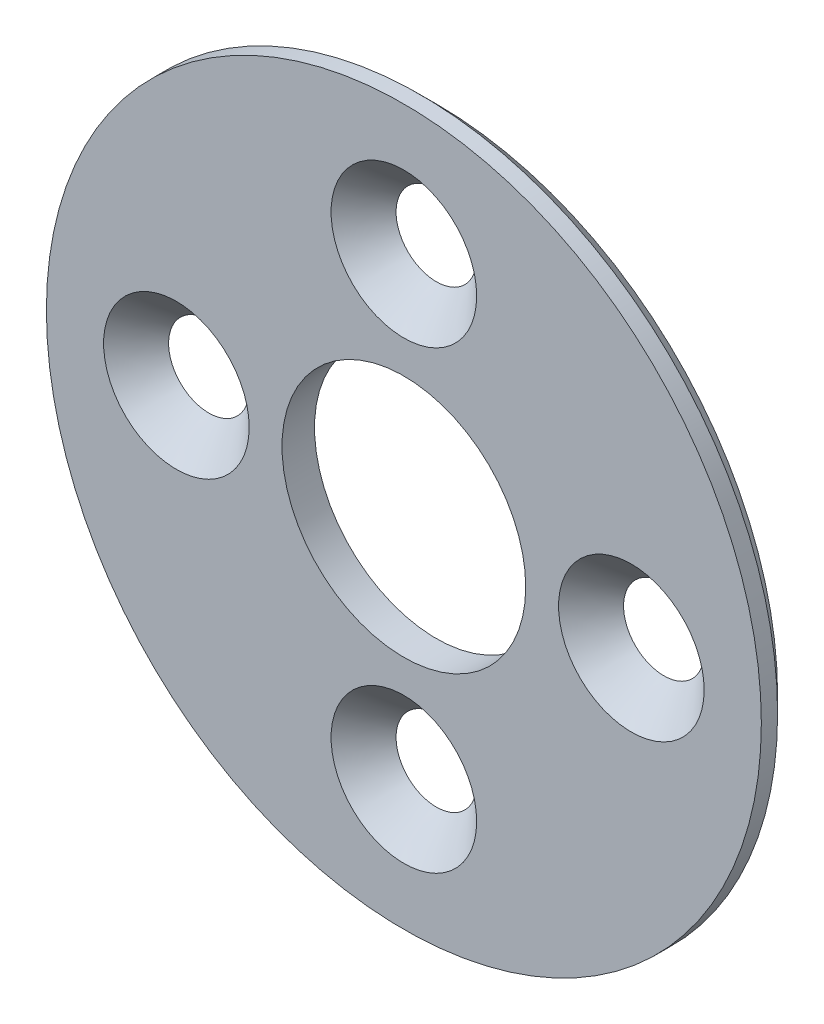
ISO-10303-21;
HEADER;
FILE_DESCRIPTION(('STEP AP214'),'2;1');
FILE_NAME('part.step','',(''),(''),'','','');
FILE_SCHEMA(('AUTOMOTIVE_DESIGN { 1 0 10303 214 1 1 1 1 }'));
ENDSEC;
DATA;
#1=APPLICATION_CONTEXT('core data for automotive mechanical design processes');
#2=APPLICATION_PROTOCOL_DEFINITION('international standard','automotive_design',2000,#1);
#3=PRODUCT_CONTEXT('',#1,'mechanical');
#4=PRODUCT('Part','Part','',(#3));
#5=PRODUCT_RELATED_PRODUCT_CATEGORY('part','',(#4));
#6=PRODUCT_DEFINITION_FORMATION('','',#4);
#7=PRODUCT_DEFINITION_CONTEXT('part definition',#1,'design');
#8=PRODUCT_DEFINITION('design','',#6,#7);
#9=PRODUCT_DEFINITION_SHAPE('','',#8);
#10=(LENGTH_UNIT() NAMED_UNIT(*) SI_UNIT(.MILLI.,.METRE.));
#11=(NAMED_UNIT(*) PLANE_ANGLE_UNIT() SI_UNIT($,.RADIAN.));
#12=(NAMED_UNIT(*) SI_UNIT($,.STERADIAN.) SOLID_ANGLE_UNIT());
#13=UNCERTAINTY_MEASURE_WITH_UNIT(LENGTH_MEASURE(1.E-05),#10,'distance_accuracy_value','');
#14=(GEOMETRIC_REPRESENTATION_CONTEXT(3) GLOBAL_UNCERTAINTY_ASSIGNED_CONTEXT((#13)) GLOBAL_UNIT_ASSIGNED_CONTEXT((#10,
#11,#12)) REPRESENTATION_CONTEXT('',''));
#15=CARTESIAN_POINT('',(0.,0.,0.));
#16=DIRECTION('',(0.,0.,1.));
#17=DIRECTION('',(1.,0.,0.));
#18=AXIS2_PLACEMENT_3D('',#15,#16,#17);
#19=CARTESIAN_POINT('',(0.,0.,0.));
#20=DIRECTION('',(0.,0.,1.));
#21=DIRECTION('',(1.,0.,0.));
#22=AXIS2_PLACEMENT_3D('',#19,#20,#21);
#23=PLANE('',#22);
#24=CARTESIAN_POINT('',(0.,14.,0.));
#25=DIRECTION('',(0.,0.,1.));
#26=DIRECTION('',(1.,0.,0.));
#27=AXIS2_PLACEMENT_3D('',#24,#25,#26);
#28=CIRCLE('',#27,2.48);
#29=CARTESIAN_POINT('',(2.48,14.,0.));
#30=VERTEX_POINT('',#29);
#31=EDGE_CURVE('E113',#30,#30,#28,.T.);
#32=ORIENTED_EDGE('',*,*,#31,.T.);
#33=EDGE_LOOP('',(#32));
#34=FACE_BOUND('',#33,.T.);
#35=CARTESIAN_POINT('',(-14.,0.,0.));
#36=DIRECTION('',(0.,0.,1.));
#37=DIRECTION('',(1.,0.,0.));
#38=AXIS2_PLACEMENT_3D('',#35,#36,#37);
#39=CIRCLE('',#38,2.48);
#40=CARTESIAN_POINT('',(-11.52,0.,0.));
#41=VERTEX_POINT('',#40);
#42=EDGE_CURVE('E35',#41,#41,#39,.T.);
#43=ORIENTED_EDGE('',*,*,#42,.T.);
#44=EDGE_LOOP('',(#43));
#45=FACE_BOUND('',#44,.T.);
#46=CARTESIAN_POINT('',(0.,0.,0.));
#47=DIRECTION('',(0.,0.,1.));
#48=DIRECTION('',(1.,0.,0.));
#49=AXIS2_PLACEMENT_3D('',#46,#47,#48);
#50=CIRCLE('',#49,7.5);
#51=CARTESIAN_POINT('',(7.5,0.,0.));
#52=VERTEX_POINT('',#51);
#53=EDGE_CURVE('E49',#52,#52,#50,.T.);
#54=ORIENTED_EDGE('',*,*,#53,.T.);
#55=EDGE_LOOP('',(#54));
#56=FACE_BOUND('',#55,.T.);
#57=CARTESIAN_POINT('',(0.,0.,0.));
#58=DIRECTION('',(0.,0.,1.));
#59=DIRECTION('',(1.,0.,0.));
#60=AXIS2_PLACEMENT_3D('',#57,#58,#59);
#61=CIRCLE('',#60,21.);
#62=CARTESIAN_POINT('',(21.,0.,0.));
#63=VERTEX_POINT('',#62);
#64=EDGE_CURVE('E10',#63,#63,#61,.F.);
#65=ORIENTED_EDGE('',*,*,#64,.T.);
#66=EDGE_LOOP('',(#65));
#67=FACE_BOUND('',#66,.T.);
#68=CARTESIAN_POINT('',(14.,0.,0.));
#69=DIRECTION('',(0.,0.,1.));
#70=DIRECTION('',(1.,0.,0.));
#71=AXIS2_PLACEMENT_3D('',#68,#69,#70);
#72=CIRCLE('',#71,2.48);
#73=CARTESIAN_POINT('',(16.48,0.,0.));
#74=VERTEX_POINT('',#73);
#75=EDGE_CURVE('E47',#74,#74,#72,.T.);
#76=ORIENTED_EDGE('',*,*,#75,.T.);
#77=EDGE_LOOP('',(#76));
#78=FACE_BOUND('',#77,.T.);
#79=CARTESIAN_POINT('',(0.,-14.,0.));
#80=DIRECTION('',(0.,0.,1.));
#81=DIRECTION('',(1.,0.,0.));
#82=AXIS2_PLACEMENT_3D('',#79,#80,#81);
#83=CIRCLE('',#82,2.48);
#84=CARTESIAN_POINT('',(2.48,-14.,0.));
#85=VERTEX_POINT('',#84);
#86=EDGE_CURVE('E117',#85,#85,#83,.T.);
#87=ORIENTED_EDGE('',*,*,#86,.T.);
#88=EDGE_LOOP('',(#87));
#89=FACE_BOUND('',#88,.T.);
#90=ADVANCED_FACE('F31',(#34,#45,#56,#67,#78,#89),#23,.F.);
#91=CARTESIAN_POINT('',(0.,0.,2.));
#92=DIRECTION('',(0.,0.,1.));
#93=DIRECTION('',(1.,0.,0.));
#94=AXIS2_PLACEMENT_3D('',#91,#92,#93);
#95=PLANE('',#94);
#96=CARTESIAN_POINT('',(0.,14.,2.));
#97=DIRECTION('',(0.,0.,1.));
#98=DIRECTION('',(1.,0.,0.));
#99=AXIS2_PLACEMENT_3D('',#96,#97,#98);
#100=CIRCLE('',#99,4.48);
#101=CARTESIAN_POINT('',(4.48,14.,2.));
#102=VERTEX_POINT('',#101);
#103=EDGE_CURVE('E111',#102,#102,#100,.T.);
#104=ORIENTED_EDGE('',*,*,#103,.F.);
#105=EDGE_LOOP('',(#104));
#106=FACE_BOUND('',#105,.T.);
#107=CARTESIAN_POINT('',(0.,-14.,2.));
#108=DIRECTION('',(0.,0.,1.));
#109=DIRECTION('',(1.,0.,0.));
#110=AXIS2_PLACEMENT_3D('',#107,#108,#109);
#111=CIRCLE('',#110,4.48);
#112=CARTESIAN_POINT('',(4.48,-14.,2.));
#113=VERTEX_POINT('',#112);
#114=EDGE_CURVE('E114',#113,#113,#111,.T.);
#115=ORIENTED_EDGE('',*,*,#114,.F.);
#116=EDGE_LOOP('',(#115));
#117=FACE_BOUND('',#116,.T.);
#118=CARTESIAN_POINT('',(-14.,0.,2.));
#119=DIRECTION('',(0.,0.,1.));
#120=DIRECTION('',(1.,0.,0.));
#121=AXIS2_PLACEMENT_3D('',#118,#119,#120);
#122=CIRCLE('',#121,4.48);
#123=CARTESIAN_POINT('',(-9.52,0.,2.));
#124=VERTEX_POINT('',#123);
#125=EDGE_CURVE('E61',#124,#124,#122,.T.);
#126=ORIENTED_EDGE('',*,*,#125,.F.);
#127=EDGE_LOOP('',(#126));
#128=FACE_BOUND('',#127,.T.);
#129=CARTESIAN_POINT('',(14.,0.,2.));
#130=DIRECTION('',(0.,0.,1.));
#131=DIRECTION('',(1.,0.,0.));
#132=AXIS2_PLACEMENT_3D('',#129,#130,#131);
#133=CIRCLE('',#132,4.48);
#134=CARTESIAN_POINT('',(18.48,0.,2.));
#135=VERTEX_POINT('',#134);
#136=EDGE_CURVE('E50',#135,#135,#133,.T.);
#137=ORIENTED_EDGE('',*,*,#136,.F.);
#138=EDGE_LOOP('',(#137));
#139=FACE_BOUND('',#138,.T.);
#140=CARTESIAN_POINT('',(0.,0.,2.));
#141=DIRECTION('',(0.,0.,1.));
#142=DIRECTION('',(1.,0.,0.));
#143=AXIS2_PLACEMENT_3D('',#140,#141,#142);
#144=CIRCLE('',#143,22.);
#145=CARTESIAN_POINT('',(22.,0.,2.));
#146=VERTEX_POINT('',#145);
#147=EDGE_CURVE('E44',#146,#146,#144,.T.);
#148=ORIENTED_EDGE('',*,*,#147,.T.);
#149=EDGE_LOOP('',(#148));
#150=FACE_BOUND('',#149,.T.);
#151=CARTESIAN_POINT('',(0.,0.,2.));
#152=DIRECTION('',(0.,0.,1.));
#153=DIRECTION('',(1.,0.,0.));
#154=AXIS2_PLACEMENT_3D('',#151,#152,#153);
#155=CIRCLE('',#154,7.5);
#156=CARTESIAN_POINT('',(7.5,0.,2.));
#157=VERTEX_POINT('',#156);
#158=EDGE_CURVE('E54',#157,#157,#155,.T.);
#159=ORIENTED_EDGE('',*,*,#158,.F.);
#160=EDGE_LOOP('',(#159));
#161=FACE_BOUND('',#160,.T.);
#162=ADVANCED_FACE('F69',(#106,#117,#128,#139,#150,#161),#95,.T.);
#163=CARTESIAN_POINT('',(0.,0.,2.));
#164=DIRECTION('',(0.,0.,-1.));
#165=DIRECTION('',(-1.,0.,0.));
#166=AXIS2_PLACEMENT_3D('',#163,#164,#165);
#167=CYLINDRICAL_SURFACE('',#166,22.);
#168=CARTESIAN_POINT('',(0.,0.,1.00000000000001));
#169=DIRECTION('',(0.,0.,1.));
#170=DIRECTION('',(1.,0.,0.));
#171=AXIS2_PLACEMENT_3D('',#168,#169,#170);
#172=CIRCLE('',#171,22.);
#173=CARTESIAN_POINT('',(22.,0.,1.00000000000001));
#174=VERTEX_POINT('',#173);
#175=EDGE_CURVE('E39',#174,#174,#172,.T.);
#176=ORIENTED_EDGE('',*,*,#175,.T.);
#177=EDGE_LOOP('',(#176));
#178=FACE_BOUND('',#177,.T.);
#179=ORIENTED_EDGE('',*,*,#147,.F.);
#180=EDGE_LOOP('',(#179));
#181=FACE_BOUND('',#180,.T.);
#182=ADVANCED_FACE('F72',(#178,#181),#167,.T.);
#183=CARTESIAN_POINT('',(0.,0.,2.));
#184=DIRECTION('',(0.,0.,-1.));
#185=DIRECTION('',(-1.,0.,0.));
#186=AXIS2_PLACEMENT_3D('',#183,#184,#185);
#187=CYLINDRICAL_SURFACE('',#186,7.5);
#188=ORIENTED_EDGE('',*,*,#158,.T.);
#189=EDGE_LOOP('',(#188));
#190=FACE_BOUND('',#189,.T.);
#191=ORIENTED_EDGE('',*,*,#53,.F.);
#192=EDGE_LOOP('',(#191));
#193=FACE_BOUND('',#192,.T.);
#194=ADVANCED_FACE('F74',(#190,#193),#187,.F.);
#195=CARTESIAN_POINT('',(0.,0.,1.00000000000001));
#196=DIRECTION('',(0.,0.,1.));
#197=DIRECTION('',(1.,0.,0.));
#198=AXIS2_PLACEMENT_3D('',#195,#196,#197);
#199=CONICAL_SURFACE('',#198,22.,0.78539816339745);
#200=ORIENTED_EDGE('',*,*,#64,.F.);
#201=EDGE_LOOP('',(#200));
#202=FACE_BOUND('',#201,.T.);
#203=ORIENTED_EDGE('',*,*,#175,.F.);
#204=EDGE_LOOP('',(#203));
#205=FACE_BOUND('',#204,.T.);
#206=ADVANCED_FACE('F33',(#202,#205),#199,.T.);
#207=CARTESIAN_POINT('',(14.,0.,2.));
#208=DIRECTION('',(0.,0.,1.));
#209=DIRECTION('',(1.,0.,0.));
#210=AXIS2_PLACEMENT_3D('',#207,#208,#209);
#211=CONICAL_SURFACE('',#210,4.48,0.785398163397448);
#212=ORIENTED_EDGE('',*,*,#136,.T.);
#213=EDGE_LOOP('',(#212));
#214=FACE_BOUND('',#213,.T.);
#215=ORIENTED_EDGE('',*,*,#75,.F.);
#216=EDGE_LOOP('',(#215));
#217=FACE_BOUND('',#216,.T.);
#218=ADVANCED_FACE('F92',(#214,#217),#211,.F.);
#219=CARTESIAN_POINT('',(-14.,0.,2.));
#220=DIRECTION('',(0.,0.,1.));
#221=DIRECTION('',(1.,0.,0.));
#222=AXIS2_PLACEMENT_3D('',#219,#220,#221);
#223=CONICAL_SURFACE('',#222,4.48,0.785398163397448);
#224=ORIENTED_EDGE('',*,*,#125,.T.);
#225=EDGE_LOOP('',(#224));
#226=FACE_BOUND('',#225,.T.);
#227=ORIENTED_EDGE('',*,*,#42,.F.);
#228=EDGE_LOOP('',(#227));
#229=FACE_BOUND('',#228,.T.);
#230=ADVANCED_FACE('F95',(#226,#229),#223,.F.);
#231=CARTESIAN_POINT('',(0.,-14.,2.));
#232=DIRECTION('',(0.,0.,1.));
#233=DIRECTION('',(1.,0.,0.));
#234=AXIS2_PLACEMENT_3D('',#231,#232,#233);
#235=CONICAL_SURFACE('',#234,4.48,0.785398163397448);
#236=ORIENTED_EDGE('',*,*,#114,.T.);
#237=EDGE_LOOP('',(#236));
#238=FACE_BOUND('',#237,.T.);
#239=ORIENTED_EDGE('',*,*,#86,.F.);
#240=EDGE_LOOP('',(#239));
#241=FACE_BOUND('',#240,.T.);
#242=ADVANCED_FACE('F98',(#238,#241),#235,.F.);
#243=CARTESIAN_POINT('',(0.,14.,2.));
#244=DIRECTION('',(0.,0.,1.));
#245=DIRECTION('',(1.,0.,0.));
#246=AXIS2_PLACEMENT_3D('',#243,#244,#245);
#247=CONICAL_SURFACE('',#246,4.48,0.785398163397448);
#248=ORIENTED_EDGE('',*,*,#103,.T.);
#249=EDGE_LOOP('',(#248));
#250=FACE_BOUND('',#249,.T.);
#251=ORIENTED_EDGE('',*,*,#31,.F.);
#252=EDGE_LOOP('',(#251));
#253=FACE_BOUND('',#252,.T.);
#254=ADVANCED_FACE('F102',(#250,#253),#247,.F.);
#255=CLOSED_SHELL('',(#90,#162,#182,#194,#206,#218,#230,#242,#254));
#256=MANIFOLD_SOLID_BREP('B2',#255);
#257=ADVANCED_BREP_SHAPE_REPRESENTATION('',(#18,#256),#14);
#258=SHAPE_DEFINITION_REPRESENTATION(#9,#257);
ENDSEC;
END-ISO-10303-21;
